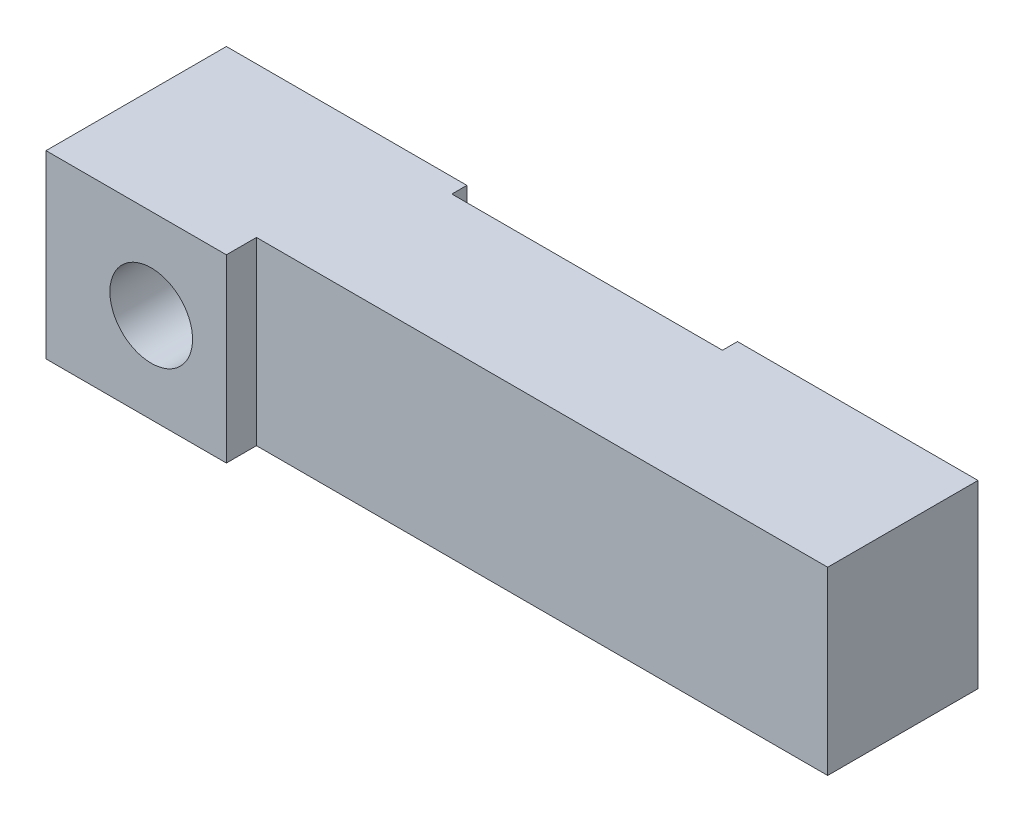
ISO-10303-21;
HEADER;
FILE_DESCRIPTION(('STEP AP214'),'2;1');
FILE_NAME('part.step','',(''),(''),'','','');
FILE_SCHEMA(('AUTOMOTIVE_DESIGN { 1 0 10303 214 1 1 1 1 }'));
ENDSEC;
DATA;
#1=APPLICATION_CONTEXT('core data for automotive mechanical design processes');
#2=APPLICATION_PROTOCOL_DEFINITION('international standard','automotive_design',2000,#1);
#3=PRODUCT_CONTEXT('',#1,'mechanical');
#4=PRODUCT('Part','Part','',(#3));
#5=PRODUCT_RELATED_PRODUCT_CATEGORY('part','',(#4));
#6=PRODUCT_DEFINITION_FORMATION('','',#4);
#7=PRODUCT_DEFINITION_CONTEXT('part definition',#1,'design');
#8=PRODUCT_DEFINITION('design','',#6,#7);
#9=PRODUCT_DEFINITION_SHAPE('','',#8);
#10=(LENGTH_UNIT() NAMED_UNIT(*) SI_UNIT(.MILLI.,.METRE.));
#11=(NAMED_UNIT(*) PLANE_ANGLE_UNIT() SI_UNIT($,.RADIAN.));
#12=(NAMED_UNIT(*) SI_UNIT($,.STERADIAN.) SOLID_ANGLE_UNIT());
#13=UNCERTAINTY_MEASURE_WITH_UNIT(LENGTH_MEASURE(1.E-05),#10,'distance_accuracy_value','');
#14=(GEOMETRIC_REPRESENTATION_CONTEXT(3) GLOBAL_UNCERTAINTY_ASSIGNED_CONTEXT((#13)) GLOBAL_UNIT_ASSIGNED_CONTEXT((#10,
#11,#12)) REPRESENTATION_CONTEXT('',''));
#15=CARTESIAN_POINT('',(0.,0.,0.));
#16=DIRECTION('',(0.,0.,1.));
#17=DIRECTION('',(1.,0.,0.));
#18=AXIS2_PLACEMENT_3D('',#15,#16,#17);
#19=CARTESIAN_POINT('',(0.,0.,0.));
#20=DIRECTION('',(0.,0.,1.));
#21=DIRECTION('',(1.,0.,0.));
#22=AXIS2_PLACEMENT_3D('',#19,#20,#21);
#23=PLANE('',#22);
#24=CARTESIAN_POINT('',(-18.,0.,0.));
#25=DIRECTION('',(0.,0.,-1.));
#26=DIRECTION('',(-1.,0.,0.));
#27=AXIS2_PLACEMENT_3D('',#24,#25,#26);
#28=CIRCLE('',#27,5.);
#29=CARTESIAN_POINT('',(-23.,0.,0.));
#30=VERTEX_POINT('',#29);
#31=EDGE_CURVE('E345',#30,#30,#28,.T.);
#32=ORIENTED_EDGE('',*,*,#31,.F.);
#33=EDGE_LOOP('',(#32));
#34=FACE_BOUND('',#33,.T.);
#35=DIRECTION('',(-1.,0.,0.));
#36=VECTOR('',#35,1.);
#37=CARTESIAN_POINT('',(-25.,6.,0.));
#38=LINE('',#37,#36);
#39=CARTESIAN_POINT('',(-9.,6.,0.));
#40=VERTEX_POINT('',#39);
#41=CARTESIAN_POINT('',(-25.,6.,0.));
#42=VERTEX_POINT('',#41);
#43=EDGE_CURVE('E171',#40,#42,#38,.T.);
#44=ORIENTED_EDGE('',*,*,#43,.F.);
#45=DIRECTION('',(0.,-1.,0.));
#46=VECTOR('',#45,1.);
#47=CARTESIAN_POINT('',(-9.,0.,0.));
#48=LINE('',#47,#46);
#49=CARTESIAN_POINT('',(-9.,-6.,0.));
#50=VERTEX_POINT('',#49);
#51=EDGE_CURVE('E12',#40,#50,#48,.T.);
#52=ORIENTED_EDGE('',*,*,#51,.T.);
#53=DIRECTION('',(1.,0.,0.));
#54=VECTOR('',#53,1.);
#55=CARTESIAN_POINT('',(-25.,-6.,0.));
#56=LINE('',#55,#54);
#57=CARTESIAN_POINT('',(-25.,-6.,0.));
#58=VERTEX_POINT('',#57);
#59=EDGE_CURVE('E164',#58,#50,#56,.T.);
#60=ORIENTED_EDGE('',*,*,#59,.F.);
#61=DIRECTION('',(0.,-1.,0.));
#62=VECTOR('',#61,1.);
#63=CARTESIAN_POINT('',(-25.,6.,0.));
#64=LINE('',#63,#62);
#65=EDGE_CURVE('E174',#42,#58,#64,.T.);
#66=ORIENTED_EDGE('',*,*,#65,.F.);
#67=EDGE_LOOP('',(#44,#52,#60,#66));
#68=FACE_BOUND('',#67,.T.);
#69=ADVANCED_FACE('F34',(#34,#68),#23,.F.);
#70=CARTESIAN_POINT('',(25.,6.,10.));
#71=DIRECTION('',(-1.,0.,0.));
#72=DIRECTION('',(0.,0.,1.));
#73=AXIS2_PLACEMENT_3D('',#70,#71,#72);
#74=PLANE('',#73);
#75=DIRECTION('',(0.,1.,0.));
#76=VECTOR('',#75,1.);
#77=CARTESIAN_POINT('',(25.,6.,0.));
#78=LINE('',#77,#76);
#79=CARTESIAN_POINT('',(25.,-6.,0.));
#80=VERTEX_POINT('',#79);
#81=CARTESIAN_POINT('',(25.,6.,0.));
#82=VERTEX_POINT('',#81);
#83=EDGE_CURVE('E159',#80,#82,#78,.T.);
#84=ORIENTED_EDGE('',*,*,#83,.T.);
#85=DIRECTION('',(0.,0.,-1.));
#86=VECTOR('',#85,1.);
#87=CARTESIAN_POINT('',(25.,6.,10.));
#88=LINE('',#87,#86);
#89=CARTESIAN_POINT('',(25.,6.,10.));
#90=VERTEX_POINT('',#89);
#91=EDGE_CURVE('E187',#90,#82,#88,.T.);
#92=ORIENTED_EDGE('',*,*,#91,.F.);
#93=DIRECTION('',(0.,1.,0.));
#94=VECTOR('',#93,1.);
#95=CARTESIAN_POINT('',(25.,6.,10.));
#96=LINE('',#95,#94);
#97=CARTESIAN_POINT('',(25.,-6.,10.));
#98=VERTEX_POINT('',#97);
#99=EDGE_CURVE('E160',#98,#90,#96,.T.);
#100=ORIENTED_EDGE('',*,*,#99,.F.);
#101=DIRECTION('',(0.,0.,-1.));
#102=VECTOR('',#101,1.);
#103=CARTESIAN_POINT('',(25.,-6.,10.));
#104=LINE('',#103,#102);
#105=EDGE_CURVE('E168',#98,#80,#104,.T.);
#106=ORIENTED_EDGE('',*,*,#105,.T.);
#107=EDGE_LOOP('',(#84,#92,#100,#106));
#108=FACE_BOUND('',#107,.T.);
#109=ADVANCED_FACE('F36',(#108),#74,.F.);
#110=CARTESIAN_POINT('',(-25.,6.,10.));
#111=DIRECTION('',(0.,-1.,0.));
#112=DIRECTION('',(0.,0.,-1.));
#113=AXIS2_PLACEMENT_3D('',#110,#111,#112);
#114=PLANE('',#113);
#115=DIRECTION('',(1.,0.,0.));
#116=VECTOR('',#115,1.);
#117=CARTESIAN_POINT('',(-9.,6.,1.));
#118=LINE('',#117,#116);
#119=CARTESIAN_POINT('',(-9.,6.,1.));
#120=VERTEX_POINT('',#119);
#121=CARTESIAN_POINT('',(9.,6.,1.));
#122=VERTEX_POINT('',#121);
#123=EDGE_CURVE('E118',#120,#122,#118,.T.);
#124=ORIENTED_EDGE('',*,*,#123,.F.);
#125=DIRECTION('',(0.,0.,1.));
#126=VECTOR('',#125,1.);
#127=CARTESIAN_POINT('',(-9.,6.,1.));
#128=LINE('',#127,#126);
#129=EDGE_CURVE('E110',#40,#120,#128,.T.);
#130=ORIENTED_EDGE('',*,*,#129,.F.);
#131=ORIENTED_EDGE('',*,*,#43,.T.);
#132=DIRECTION('',(0.,0.,-1.));
#133=VECTOR('',#132,1.);
#134=CARTESIAN_POINT('',(-25.,6.,10.));
#135=LINE('',#134,#133);
#136=CARTESIAN_POINT('',(-25.,6.,12.));
#137=VERTEX_POINT('',#136);
#138=EDGE_CURVE('E184',#137,#42,#135,.T.);
#139=ORIENTED_EDGE('',*,*,#138,.F.);
#140=DIRECTION('',(-1.,0.,0.));
#141=VECTOR('',#140,1.);
#142=CARTESIAN_POINT('',(-25.,6.,12.));
#143=LINE('',#142,#141);
#144=CARTESIAN_POINT('',(-13.,6.,12.));
#145=VERTEX_POINT('',#144);
#146=EDGE_CURVE('E149',#145,#137,#143,.T.);
#147=ORIENTED_EDGE('',*,*,#146,.F.);
#148=DIRECTION('',(0.,0.,-1.));
#149=VECTOR('',#148,1.);
#150=CARTESIAN_POINT('',(-13.,6.,12.));
#151=LINE('',#150,#149);
#152=CARTESIAN_POINT('',(-13.,6.,10.));
#153=VERTEX_POINT('',#152);
#154=EDGE_CURVE('E152',#145,#153,#151,.T.);
#155=ORIENTED_EDGE('',*,*,#154,.T.);
#156=DIRECTION('',(-1.,0.,0.));
#157=VECTOR('',#156,1.);
#158=CARTESIAN_POINT('',(-25.,6.,10.));
#159=LINE('',#158,#157);
#160=EDGE_CURVE('E163',#90,#153,#159,.T.);
#161=ORIENTED_EDGE('',*,*,#160,.F.);
#162=ORIENTED_EDGE('',*,*,#91,.T.);
#163=CARTESIAN_POINT('',(9.,6.,0.));
#164=VERTEX_POINT('',#163);
#165=EDGE_CURVE('E172',#82,#164,#38,.T.);
#166=ORIENTED_EDGE('',*,*,#165,.T.);
#167=DIRECTION('',(0.,0.,-1.));
#168=VECTOR('',#167,1.);
#169=CARTESIAN_POINT('',(9.,6.,1.));
#170=LINE('',#169,#168);
#171=EDGE_CURVE('E49',#122,#164,#170,.T.);
#172=ORIENTED_EDGE('',*,*,#171,.F.);
#173=EDGE_LOOP('',(#124,#130,#131,#139,#147,#155,#161,#162,#166,#172));
#174=FACE_BOUND('',#173,.T.);
#175=ADVANCED_FACE('F130',(#174),#114,.F.);
#176=CARTESIAN_POINT('',(-25.,6.,10.));
#177=DIRECTION('',(1.,0.,0.));
#178=DIRECTION('',(0.,0.,-1.));
#179=AXIS2_PLACEMENT_3D('',#176,#177,#178);
#180=PLANE('',#179);
#181=ORIENTED_EDGE('',*,*,#65,.T.);
#182=DIRECTION('',(0.,0.,-1.));
#183=VECTOR('',#182,1.);
#184=CARTESIAN_POINT('',(-25.,-6.,10.));
#185=LINE('',#184,#183);
#186=CARTESIAN_POINT('',(-25.,-6.,12.));
#187=VERTEX_POINT('',#186);
#188=EDGE_CURVE('E181',#187,#58,#185,.T.);
#189=ORIENTED_EDGE('',*,*,#188,.F.);
#190=DIRECTION('',(0.,-1.,0.));
#191=VECTOR('',#190,1.);
#192=CARTESIAN_POINT('',(-25.,6.,12.));
#193=LINE('',#192,#191);
#194=EDGE_CURVE('E142',#137,#187,#193,.T.);
#195=ORIENTED_EDGE('',*,*,#194,.F.);
#196=ORIENTED_EDGE('',*,*,#138,.T.);
#197=EDGE_LOOP('',(#181,#189,#195,#196));
#198=FACE_BOUND('',#197,.T.);
#199=ADVANCED_FACE('F235',(#198),#180,.F.);
#200=CARTESIAN_POINT('',(-25.,-6.,10.));
#201=DIRECTION('',(0.,1.,0.));
#202=DIRECTION('',(0.,0.,1.));
#203=AXIS2_PLACEMENT_3D('',#200,#201,#202);
#204=PLANE('',#203);
#205=ORIENTED_EDGE('',*,*,#59,.T.);
#206=DIRECTION('',(0.,0.,1.));
#207=VECTOR('',#206,1.);
#208=CARTESIAN_POINT('',(-9.,-6.,1.));
#209=LINE('',#208,#207);
#210=CARTESIAN_POINT('',(-9.,-6.,1.));
#211=VERTEX_POINT('',#210);
#212=EDGE_CURVE('E133',#50,#211,#209,.T.);
#213=ORIENTED_EDGE('',*,*,#212,.T.);
#214=DIRECTION('',(1.,0.,0.));
#215=VECTOR('',#214,1.);
#216=CARTESIAN_POINT('',(-9.,-6.,1.));
#217=LINE('',#216,#215);
#218=CARTESIAN_POINT('',(9.,-6.,1.));
#219=VERTEX_POINT('',#218);
#220=EDGE_CURVE('E125',#211,#219,#217,.T.);
#221=ORIENTED_EDGE('',*,*,#220,.T.);
#222=DIRECTION('',(0.,0.,-1.));
#223=VECTOR('',#222,1.);
#224=CARTESIAN_POINT('',(9.,-6.,1.));
#225=LINE('',#224,#223);
#226=CARTESIAN_POINT('',(9.,-6.,0.));
#227=VERTEX_POINT('',#226);
#228=EDGE_CURVE('E128',#219,#227,#225,.T.);
#229=ORIENTED_EDGE('',*,*,#228,.T.);
#230=EDGE_CURVE('E176',#227,#80,#56,.T.);
#231=ORIENTED_EDGE('',*,*,#230,.T.);
#232=ORIENTED_EDGE('',*,*,#105,.F.);
#233=DIRECTION('',(1.,0.,0.));
#234=VECTOR('',#233,1.);
#235=CARTESIAN_POINT('',(-25.,-6.,10.));
#236=LINE('',#235,#234);
#237=CARTESIAN_POINT('',(-13.,-6.,10.));
#238=VERTEX_POINT('',#237);
#239=EDGE_CURVE('E166',#238,#98,#236,.T.);
#240=ORIENTED_EDGE('',*,*,#239,.F.);
#241=DIRECTION('',(0.,0.,-1.));
#242=VECTOR('',#241,1.);
#243=CARTESIAN_POINT('',(-13.,-6.,12.));
#244=LINE('',#243,#242);
#245=CARTESIAN_POINT('',(-13.,-6.,12.));
#246=VERTEX_POINT('',#245);
#247=EDGE_CURVE('E156',#246,#238,#244,.T.);
#248=ORIENTED_EDGE('',*,*,#247,.F.);
#249=DIRECTION('',(1.,0.,0.));
#250=VECTOR('',#249,1.);
#251=CARTESIAN_POINT('',(-25.,-6.,12.));
#252=LINE('',#251,#250);
#253=EDGE_CURVE('E145',#187,#246,#252,.T.);
#254=ORIENTED_EDGE('',*,*,#253,.F.);
#255=ORIENTED_EDGE('',*,*,#188,.T.);
#256=EDGE_LOOP('',(#205,#213,#221,#229,#231,#232,#240,#248,#254,#255));
#257=FACE_BOUND('',#256,.T.);
#258=ADVANCED_FACE('F199',(#257),#204,.F.);
#259=CARTESIAN_POINT('',(0.,0.,10.));
#260=DIRECTION('',(0.,0.,1.));
#261=DIRECTION('',(1.,0.,0.));
#262=AXIS2_PLACEMENT_3D('',#259,#260,#261);
#263=PLANE('',#262);
#264=DIRECTION('',(0.,1.,0.));
#265=VECTOR('',#264,1.);
#266=CARTESIAN_POINT('',(-13.,6.,10.));
#267=LINE('',#266,#265);
#268=EDGE_CURVE('E57',#238,#153,#267,.T.);
#269=ORIENTED_EDGE('',*,*,#268,.F.);
#270=ORIENTED_EDGE('',*,*,#239,.T.);
#271=ORIENTED_EDGE('',*,*,#99,.T.);
#272=ORIENTED_EDGE('',*,*,#160,.T.);
#273=EDGE_LOOP('',(#269,#270,#271,#272));
#274=FACE_BOUND('',#273,.T.);
#275=ADVANCED_FACE('F225',(#274),#263,.T.);
#276=ORIENTED_EDGE('',*,*,#230,.F.);
#277=DIRECTION('',(0.,1.,0.));
#278=VECTOR('',#277,1.);
#279=CARTESIAN_POINT('',(9.,0.,0.));
#280=LINE('',#279,#278);
#281=EDGE_CURVE('E42',#227,#164,#280,.T.);
#282=ORIENTED_EDGE('',*,*,#281,.T.);
#283=ORIENTED_EDGE('',*,*,#165,.F.);
#284=ORIENTED_EDGE('',*,*,#83,.F.);
#285=EDGE_LOOP('',(#276,#282,#283,#284));
#286=FACE_BOUND('',#285,.T.);
#287=ADVANCED_FACE('F191',(#286),#23,.F.);
#288=CARTESIAN_POINT('',(-13.,6.,12.));
#289=DIRECTION('',(-1.,0.,0.));
#290=DIRECTION('',(0.,-1.,0.));
#291=AXIS2_PLACEMENT_3D('',#288,#289,#290);
#292=PLANE('',#291);
#293=ORIENTED_EDGE('',*,*,#268,.T.);
#294=ORIENTED_EDGE('',*,*,#154,.F.);
#295=DIRECTION('',(0.,1.,0.));
#296=VECTOR('',#295,1.);
#297=CARTESIAN_POINT('',(-13.,6.,12.));
#298=LINE('',#297,#296);
#299=EDGE_CURVE('E147',#246,#145,#298,.T.);
#300=ORIENTED_EDGE('',*,*,#299,.F.);
#301=ORIENTED_EDGE('',*,*,#247,.T.);
#302=EDGE_LOOP('',(#293,#294,#300,#301));
#303=FACE_BOUND('',#302,.T.);
#304=ADVANCED_FACE('F224',(#303),#292,.F.);
#305=CARTESIAN_POINT('',(0.,0.,12.));
#306=DIRECTION('',(0.,0.,1.));
#307=DIRECTION('',(1.,0.,0.));
#308=AXIS2_PLACEMENT_3D('',#305,#306,#307);
#309=PLANE('',#308);
#310=CARTESIAN_POINT('',(-18.,0.,12.));
#311=DIRECTION('',(0.,0.,-1.));
#312=DIRECTION('',(-1.,0.,0.));
#313=AXIS2_PLACEMENT_3D('',#310,#311,#312);
#314=CIRCLE('',#313,2.75);
#315=CARTESIAN_POINT('',(-20.75,0.,12.));
#316=VERTEX_POINT('',#315);
#317=EDGE_CURVE('E119',#316,#316,#314,.T.);
#318=ORIENTED_EDGE('',*,*,#317,.T.);
#319=EDGE_LOOP('',(#318));
#320=FACE_BOUND('',#319,.T.);
#321=ORIENTED_EDGE('',*,*,#194,.T.);
#322=ORIENTED_EDGE('',*,*,#253,.T.);
#323=ORIENTED_EDGE('',*,*,#299,.T.);
#324=ORIENTED_EDGE('',*,*,#146,.T.);
#325=EDGE_LOOP('',(#321,#322,#323,#324));
#326=FACE_BOUND('',#325,.T.);
#327=ADVANCED_FACE('F210',(#320,#326),#309,.T.);
#328=CARTESIAN_POINT('',(-9.,-6.,1.));
#329=DIRECTION('',(-1.,0.,0.));
#330=DIRECTION('',(0.,0.,1.));
#331=AXIS2_PLACEMENT_3D('',#328,#329,#330);
#332=PLANE('',#331);
#333=ORIENTED_EDGE('',*,*,#129,.T.);
#334=DIRECTION('',(0.,1.,0.));
#335=VECTOR('',#334,1.);
#336=CARTESIAN_POINT('',(-9.,-6.,1.));
#337=LINE('',#336,#335);
#338=EDGE_CURVE('E113',#211,#120,#337,.T.);
#339=ORIENTED_EDGE('',*,*,#338,.F.);
#340=ORIENTED_EDGE('',*,*,#212,.F.);
#341=ORIENTED_EDGE('',*,*,#51,.F.);
#342=EDGE_LOOP('',(#333,#339,#340,#341));
#343=FACE_BOUND('',#342,.T.);
#344=ADVANCED_FACE('F112',(#343),#332,.F.);
#345=CARTESIAN_POINT('',(9.,-6.,1.));
#346=DIRECTION('',(1.,0.,0.));
#347=DIRECTION('',(0.,0.,-1.));
#348=AXIS2_PLACEMENT_3D('',#345,#346,#347);
#349=PLANE('',#348);
#350=ORIENTED_EDGE('',*,*,#228,.F.);
#351=DIRECTION('',(0.,1.,0.));
#352=VECTOR('',#351,1.);
#353=CARTESIAN_POINT('',(9.,-6.,1.));
#354=LINE('',#353,#352);
#355=EDGE_CURVE('E127',#219,#122,#354,.T.);
#356=ORIENTED_EDGE('',*,*,#355,.T.);
#357=ORIENTED_EDGE('',*,*,#171,.T.);
#358=ORIENTED_EDGE('',*,*,#281,.F.);
#359=EDGE_LOOP('',(#350,#356,#357,#358));
#360=FACE_BOUND('',#359,.T.);
#361=ADVANCED_FACE('F201',(#360),#349,.F.);
#362=CARTESIAN_POINT('',(-9.,-6.,1.));
#363=DIRECTION('',(0.,0.,1.));
#364=DIRECTION('',(1.,0.,0.));
#365=AXIS2_PLACEMENT_3D('',#362,#363,#364);
#366=PLANE('',#365);
#367=ORIENTED_EDGE('',*,*,#355,.F.);
#368=ORIENTED_EDGE('',*,*,#220,.F.);
#369=ORIENTED_EDGE('',*,*,#338,.T.);
#370=ORIENTED_EDGE('',*,*,#123,.T.);
#371=EDGE_LOOP('',(#367,#368,#369,#370));
#372=FACE_BOUND('',#371,.T.);
#373=ADVANCED_FACE('F123',(#372),#366,.F.);
#374=CARTESIAN_POINT('',(-18.,0.,0.));
#375=DIRECTION('',(0.,0.,-1.));
#376=DIRECTION('',(-1.,0.,0.));
#377=AXIS2_PLACEMENT_3D('',#374,#375,#376);
#378=CYLINDRICAL_SURFACE('',#377,2.75);
#379=ORIENTED_EDGE('',*,*,#317,.F.);
#380=EDGE_LOOP('',(#379));
#381=FACE_BOUND('',#380,.T.);
#382=CARTESIAN_POINT('',(-18.,0.,5.4));
#383=DIRECTION('',(0.,0.,-1.));
#384=DIRECTION('',(-1.,0.,0.));
#385=AXIS2_PLACEMENT_3D('',#382,#383,#384);
#386=CIRCLE('',#385,2.75);
#387=CARTESIAN_POINT('',(-20.75,0.,5.4));
#388=VERTEX_POINT('',#387);
#389=EDGE_CURVE('E347',#388,#388,#386,.T.);
#390=ORIENTED_EDGE('',*,*,#389,.T.);
#391=EDGE_LOOP('',(#390));
#392=FACE_BOUND('',#391,.T.);
#393=ADVANCED_FACE('F208',(#381,#392),#378,.F.);
#394=CARTESIAN_POINT('',(-15.25,0.,5.4));
#395=DIRECTION('',(0.,0.,1.));
#396=DIRECTION('',(1.,0.,0.));
#397=AXIS2_PLACEMENT_3D('',#394,#395,#396);
#398=PLANE('',#397);
#399=ORIENTED_EDGE('',*,*,#389,.F.);
#400=EDGE_LOOP('',(#399));
#401=FACE_BOUND('',#400,.T.);
#402=CARTESIAN_POINT('',(-18.,0.,5.4));
#403=DIRECTION('',(0.,0.,-1.));
#404=DIRECTION('',(-1.,0.,0.));
#405=AXIS2_PLACEMENT_3D('',#402,#403,#404);
#406=CIRCLE('',#405,5.);
#407=CARTESIAN_POINT('',(-23.,0.,5.4));
#408=VERTEX_POINT('',#407);
#409=EDGE_CURVE('E343',#408,#408,#406,.T.);
#410=ORIENTED_EDGE('',*,*,#409,.T.);
#411=EDGE_LOOP('',(#410));
#412=FACE_BOUND('',#411,.T.);
#413=ADVANCED_FACE('F317',(#401,#412),#398,.F.);
#414=CARTESIAN_POINT('',(-18.,0.,0.));
#415=DIRECTION('',(0.,0.,-1.));
#416=DIRECTION('',(-1.,0.,0.));
#417=AXIS2_PLACEMENT_3D('',#414,#415,#416);
#418=CYLINDRICAL_SURFACE('',#417,5.);
#419=ORIENTED_EDGE('',*,*,#409,.F.);
#420=EDGE_LOOP('',(#419));
#421=FACE_BOUND('',#420,.T.);
#422=ORIENTED_EDGE('',*,*,#31,.T.);
#423=EDGE_LOOP('',(#422));
#424=FACE_BOUND('',#423,.T.);
#425=ADVANCED_FACE('F325',(#421,#424),#418,.F.);
#426=CLOSED_SHELL('',(#69,#109,#175,#199,#258,#275,#287,#304,#327,#344,#361,#373,#393,#413,#425));
#427=MANIFOLD_SOLID_BREP('B2',#426);
#428=ADVANCED_BREP_SHAPE_REPRESENTATION('',(#18,#427),#14);
#429=SHAPE_DEFINITION_REPRESENTATION(#9,#428);
ENDSEC;
END-ISO-10303-21;
